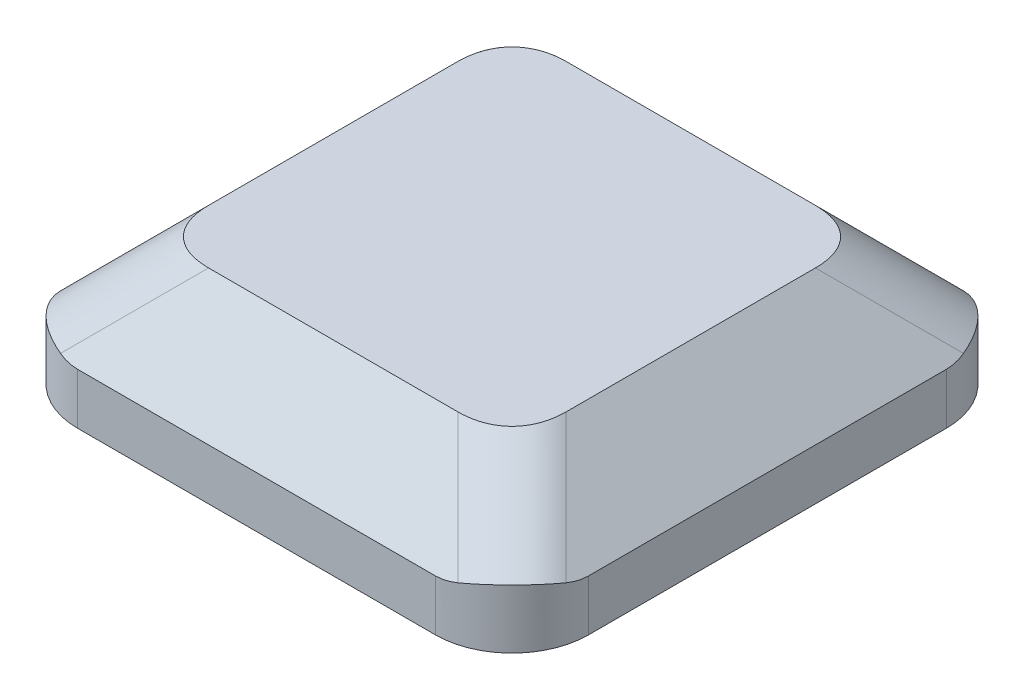
ISO-10303-21;
HEADER;
FILE_DESCRIPTION(('STEP AP214'),'2;1');
FILE_NAME('part.step','',(''),(''),'','','');
FILE_SCHEMA(('AUTOMOTIVE_DESIGN { 1 0 10303 214 1 1 1 1 }'));
ENDSEC;
DATA;
#1=APPLICATION_CONTEXT('core data for automotive mechanical design processes');
#2=APPLICATION_PROTOCOL_DEFINITION('international standard','automotive_design',2000,#1);
#3=PRODUCT_CONTEXT('',#1,'mechanical');
#4=PRODUCT('Part','Part','',(#3));
#5=PRODUCT_RELATED_PRODUCT_CATEGORY('part','',(#4));
#6=PRODUCT_DEFINITION_FORMATION('','',#4);
#7=PRODUCT_DEFINITION_CONTEXT('part definition',#1,'design');
#8=PRODUCT_DEFINITION('design','',#6,#7);
#9=PRODUCT_DEFINITION_SHAPE('','',#8);
#10=(LENGTH_UNIT() NAMED_UNIT(*) SI_UNIT(.MILLI.,.METRE.));
#11=(NAMED_UNIT(*) PLANE_ANGLE_UNIT() SI_UNIT($,.RADIAN.));
#12=(NAMED_UNIT(*) SI_UNIT($,.STERADIAN.) SOLID_ANGLE_UNIT());
#13=UNCERTAINTY_MEASURE_WITH_UNIT(LENGTH_MEASURE(1.E-05),#10,'distance_accuracy_value','');
#14=(GEOMETRIC_REPRESENTATION_CONTEXT(3) GLOBAL_UNCERTAINTY_ASSIGNED_CONTEXT((#13)) GLOBAL_UNIT_ASSIGNED_CONTEXT((#10,
#11,#12)) REPRESENTATION_CONTEXT('',''));
#15=CARTESIAN_POINT('',(0.,0.,0.));
#16=DIRECTION('',(0.,0.,1.));
#17=DIRECTION('',(1.,0.,0.));
#18=AXIS2_PLACEMENT_3D('',#15,#16,#17);
#19=CARTESIAN_POINT('',(0.,5.,0.));
#20=DIRECTION('',(0.,0.,-1.));
#21=DIRECTION('',(-1.,0.,0.));
#22=AXIS2_PLACEMENT_3D('',#19,#20,#21);
#23=PLANE('',#22);
#24=DIRECTION('',(-1.,0.,0.));
#25=VECTOR('',#24,1.);
#26=CARTESIAN_POINT('',(0.,1.99999999999999,0.));
#27=LINE('',#26,#25);
#28=CARTESIAN_POINT('',(17.,1.99999999999999,0.));
#29=VERTEX_POINT('',#28);
#30=CARTESIAN_POINT('',(3.,1.99999999999999,0.));
#31=VERTEX_POINT('',#30);
#32=EDGE_CURVE('E154',#29,#31,#27,.T.);
#33=ORIENTED_EDGE('',*,*,#32,.T.);
#34=DIRECTION('',(0.,-1.,0.));
#35=VECTOR('',#34,1.);
#36=CARTESIAN_POINT('',(3.,5.,0.));
#37=LINE('',#36,#35);
#38=CARTESIAN_POINT('',(3.,0.,0.));
#39=VERTEX_POINT('',#38);
#40=EDGE_CURVE('E161',#31,#39,#37,.T.);
#41=ORIENTED_EDGE('',*,*,#40,.T.);
#42=DIRECTION('',(1.,0.,0.));
#43=VECTOR('',#42,1.);
#44=CARTESIAN_POINT('',(0.,0.,0.));
#45=LINE('',#44,#43);
#46=CARTESIAN_POINT('',(17.,0.,0.));
#47=VERTEX_POINT('',#46);
#48=EDGE_CURVE('E157',#39,#47,#45,.T.);
#49=ORIENTED_EDGE('',*,*,#48,.T.);
#50=DIRECTION('',(0.,-1.,0.));
#51=VECTOR('',#50,1.);
#52=CARTESIAN_POINT('',(17.,1.99999999999999,0.));
#53=LINE('',#52,#51);
#54=EDGE_CURVE('E151',#47,#29,#53,.F.);
#55=ORIENTED_EDGE('',*,*,#54,.T.);
#56=EDGE_LOOP('',(#33,#41,#49,#55));
#57=FACE_BOUND('',#56,.T.);
#58=ADVANCED_FACE('F36',(#57),#23,.F.);
#59=CARTESIAN_POINT('',(20.,5.,-20.));
#60=DIRECTION('',(1.,0.,0.));
#61=DIRECTION('',(0.,0.,-1.));
#62=AXIS2_PLACEMENT_3D('',#59,#60,#61);
#63=PLANE('',#62);
#64=DIRECTION('',(0.,0.,1.));
#65=VECTOR('',#64,1.);
#66=CARTESIAN_POINT('',(20.,0.,-20.));
#67=LINE('',#66,#65);
#68=CARTESIAN_POINT('',(20.,0.,-17.));
#69=VERTEX_POINT('',#68);
#70=CARTESIAN_POINT('',(20.,0.,-3.));
#71=VERTEX_POINT('',#70);
#72=EDGE_CURVE('E293',#69,#71,#67,.T.);
#73=ORIENTED_EDGE('',*,*,#72,.F.);
#74=DIRECTION('',(0.,-1.,0.));
#75=VECTOR('',#74,1.);
#76=CARTESIAN_POINT('',(20.,5.,-17.));
#77=LINE('',#76,#75);
#78=CARTESIAN_POINT('',(20.,1.99999999999999,-17.));
#79=VERTEX_POINT('',#78);
#80=EDGE_CURVE('E209',#69,#79,#77,.F.);
#81=ORIENTED_EDGE('',*,*,#80,.T.);
#82=DIRECTION('',(0.,0.,1.));
#83=VECTOR('',#82,1.);
#84=CARTESIAN_POINT('',(20.,1.99999999999999,0.));
#85=LINE('',#84,#83);
#86=CARTESIAN_POINT('',(20.,1.99999999999999,-3.));
#87=VERTEX_POINT('',#86);
#88=EDGE_CURVE('E170',#79,#87,#85,.T.);
#89=ORIENTED_EDGE('',*,*,#88,.T.);
#90=DIRECTION('',(0.,-1.,0.));
#91=VECTOR('',#90,1.);
#92=CARTESIAN_POINT('',(20.,0.,-3.));
#93=LINE('',#92,#91);
#94=EDGE_CURVE('E207',#87,#71,#93,.T.);
#95=ORIENTED_EDGE('',*,*,#94,.T.);
#96=EDGE_LOOP('',(#73,#81,#89,#95));
#97=FACE_BOUND('',#96,.T.);
#98=ADVANCED_FACE('F325',(#97),#63,.T.);
#99=CARTESIAN_POINT('',(0.,5.,-20.));
#100=DIRECTION('',(0.,0.,-1.));
#101=DIRECTION('',(-1.,0.,0.));
#102=AXIS2_PLACEMENT_3D('',#99,#100,#101);
#103=PLANE('',#102);
#104=DIRECTION('',(1.,0.,0.));
#105=VECTOR('',#104,1.);
#106=CARTESIAN_POINT('',(0.,0.,-20.));
#107=LINE('',#106,#105);
#108=CARTESIAN_POINT('',(3.,0.,-20.));
#109=VERTEX_POINT('',#108);
#110=CARTESIAN_POINT('',(17.,0.,-20.));
#111=VERTEX_POINT('',#110);
#112=EDGE_CURVE('E242',#109,#111,#107,.T.);
#113=ORIENTED_EDGE('',*,*,#112,.F.);
#114=DIRECTION('',(0.,-1.,0.));
#115=VECTOR('',#114,1.);
#116=CARTESIAN_POINT('',(3.,1.99999999999999,-20.));
#117=LINE('',#116,#115);
#118=CARTESIAN_POINT('',(3.,1.99999999999999,-20.));
#119=VERTEX_POINT('',#118);
#120=EDGE_CURVE('E197',#109,#119,#117,.F.);
#121=ORIENTED_EDGE('',*,*,#120,.T.);
#122=DIRECTION('',(1.,0.,0.));
#123=VECTOR('',#122,1.);
#124=CARTESIAN_POINT('',(20.,1.99999999999999,-20.));
#125=LINE('',#124,#123);
#126=CARTESIAN_POINT('',(17.,1.99999999999999,-20.));
#127=VERTEX_POINT('',#126);
#128=EDGE_CURVE('E253',#119,#127,#125,.T.);
#129=ORIENTED_EDGE('',*,*,#128,.T.);
#130=DIRECTION('',(0.,-1.,0.));
#131=VECTOR('',#130,1.);
#132=CARTESIAN_POINT('',(17.,5.,-20.));
#133=LINE('',#132,#131);
#134=EDGE_CURVE('E194',#127,#111,#133,.T.);
#135=ORIENTED_EDGE('',*,*,#134,.T.);
#136=EDGE_LOOP('',(#113,#121,#129,#135));
#137=FACE_BOUND('',#136,.T.);
#138=ADVANCED_FACE('F301',(#137),#103,.T.);
#139=CARTESIAN_POINT('',(0.,5.,-20.));
#140=DIRECTION('',(1.,0.,0.));
#141=DIRECTION('',(0.,0.,-1.));
#142=AXIS2_PLACEMENT_3D('',#139,#140,#141);
#143=PLANE('',#142);
#144=DIRECTION('',(0.,0.,1.));
#145=VECTOR('',#144,1.);
#146=CARTESIAN_POINT('',(0.,0.,-20.));
#147=LINE('',#146,#145);
#148=CARTESIAN_POINT('',(0.,0.,-17.));
#149=VERTEX_POINT('',#148);
#150=CARTESIAN_POINT('',(0.,0.,-3.));
#151=VERTEX_POINT('',#150);
#152=EDGE_CURVE('E237',#149,#151,#147,.T.);
#153=ORIENTED_EDGE('',*,*,#152,.T.);
#154=DIRECTION('',(0.,-1.,0.));
#155=VECTOR('',#154,1.);
#156=CARTESIAN_POINT('',(0.,5.,-3.));
#157=LINE('',#156,#155);
#158=CARTESIAN_POINT('',(0.,1.99999999999999,-3.));
#159=VERTEX_POINT('',#158);
#160=EDGE_CURVE('E270',#151,#159,#157,.F.);
#161=ORIENTED_EDGE('',*,*,#160,.T.);
#162=DIRECTION('',(0.,0.,-1.));
#163=VECTOR('',#162,1.);
#164=CARTESIAN_POINT('',(0.,1.99999999999999,-20.));
#165=LINE('',#164,#163);
#166=CARTESIAN_POINT('',(0.,1.99999999999999,-17.));
#167=VERTEX_POINT('',#166);
#168=EDGE_CURVE('E250',#159,#167,#165,.T.);
#169=ORIENTED_EDGE('',*,*,#168,.T.);
#170=DIRECTION('',(0.,-1.,0.));
#171=VECTOR('',#170,1.);
#172=CARTESIAN_POINT('',(0.,0.,-17.));
#173=LINE('',#172,#171);
#174=EDGE_CURVE('E267',#167,#149,#173,.T.);
#175=ORIENTED_EDGE('',*,*,#174,.T.);
#176=EDGE_LOOP('',(#153,#161,#169,#175));
#177=FACE_BOUND('',#176,.T.);
#178=ADVANCED_FACE('F317',(#177),#143,.F.);
#179=CARTESIAN_POINT('',(0.,5.,0.));
#180=DIRECTION('',(0.,-1.,0.));
#181=DIRECTION('',(0.,0.,-1.));
#182=AXIS2_PLACEMENT_3D('',#179,#180,#181);
#183=PLANE('',#182);
#184=DIRECTION('',(0.,0.,1.));
#185=VECTOR('',#184,1.);
#186=CARTESIAN_POINT('',(3.,5.,0.));
#187=LINE('',#186,#185);
#188=CARTESIAN_POINT('',(3.,5.,-14.8786796564404));
#189=VERTEX_POINT('',#188);
#190=CARTESIAN_POINT('',(3.,5.,-5.12132034355965));
#191=VERTEX_POINT('',#190);
#192=EDGE_CURVE('E248',#189,#191,#187,.T.);
#193=ORIENTED_EDGE('',*,*,#192,.T.);
#194=CARTESIAN_POINT('',(7.24264068711928,5.,-7.24264068711928));
#195=DIRECTION('',(0.,-1.,0.));
#196=DIRECTION('',(0.707106781186548,0.,-0.707106781186548));
#197=AXIS2_PLACEMENT_3D('',#194,#195,#196);
#198=ELLIPSE('',#197,5.19615242270662,3.);
#199=CARTESIAN_POINT('',(5.12132034355965,5.,-3.));
#200=VERTEX_POINT('',#199);
#201=EDGE_CURVE('E192',#191,#200,#198,.F.);
#202=ORIENTED_EDGE('',*,*,#201,.T.);
#203=DIRECTION('',(1.,0.,0.));
#204=VECTOR('',#203,1.);
#205=CARTESIAN_POINT('',(0.,5.,-3.));
#206=LINE('',#205,#204);
#207=CARTESIAN_POINT('',(14.8786796564404,5.,-3.));
#208=VERTEX_POINT('',#207);
#209=EDGE_CURVE('E229',#200,#208,#206,.T.);
#210=ORIENTED_EDGE('',*,*,#209,.T.);
#211=CARTESIAN_POINT('',(12.7573593128807,5.,-7.24264068711928));
#212=DIRECTION('',(0.,-1.,0.));
#213=DIRECTION('',(0.707106781186548,0.,0.707106781186547));
#214=AXIS2_PLACEMENT_3D('',#211,#212,#213);
#215=ELLIPSE('',#214,5.19615242270662,3.);
#216=CARTESIAN_POINT('',(17.,5.,-5.12132034355965));
#217=VERTEX_POINT('',#216);
#218=EDGE_CURVE('E186',#208,#217,#215,.F.);
#219=ORIENTED_EDGE('',*,*,#218,.T.);
#220=DIRECTION('',(0.,0.,-1.));
#221=VECTOR('',#220,1.);
#222=CARTESIAN_POINT('',(17.,5.,-20.));
#223=LINE('',#222,#221);
#224=CARTESIAN_POINT('',(17.,5.,-14.8786796564404));
#225=VERTEX_POINT('',#224);
#226=EDGE_CURVE('E236',#217,#225,#223,.T.);
#227=ORIENTED_EDGE('',*,*,#226,.T.);
#228=CARTESIAN_POINT('',(12.7573593128807,5.,-12.7573593128807));
#229=DIRECTION('',(0.,-1.,0.));
#230=DIRECTION('',(0.707106781186547,0.,-0.707106781186548));
#231=AXIS2_PLACEMENT_3D('',#228,#229,#230);
#232=ELLIPSE('',#231,5.19615242270662,3.);
#233=CARTESIAN_POINT('',(14.8786796564404,5.,-17.));
#234=VERTEX_POINT('',#233);
#235=EDGE_CURVE('E188',#225,#234,#232,.F.);
#236=ORIENTED_EDGE('',*,*,#235,.T.);
#237=DIRECTION('',(-1.,0.,0.));
#238=VECTOR('',#237,1.);
#239=CARTESIAN_POINT('',(0.,5.,-17.));
#240=LINE('',#239,#238);
#241=CARTESIAN_POINT('',(5.12132034355964,5.,-17.));
#242=VERTEX_POINT('',#241);
#243=EDGE_CURVE('E239',#234,#242,#240,.T.);
#244=ORIENTED_EDGE('',*,*,#243,.T.);
#245=CARTESIAN_POINT('',(7.24264068711928,5.,-12.7573593128807));
#246=DIRECTION('',(0.,-1.,0.));
#247=DIRECTION('',(0.707106781186548,0.,0.707106781186548));
#248=AXIS2_PLACEMENT_3D('',#245,#246,#247);
#249=ELLIPSE('',#248,5.19615242270662,3.);
#250=EDGE_CURVE('E190',#242,#189,#249,.F.);
#251=ORIENTED_EDGE('',*,*,#250,.T.);
#252=EDGE_LOOP('',(#193,#202,#210,#219,#227,#236,#244,#251));
#253=FACE_BOUND('',#252,.T.);
#254=ADVANCED_FACE('F233',(#253),#183,.F.);
#255=CARTESIAN_POINT('',(0.,0.,0.));
#256=DIRECTION('',(0.,-1.,0.));
#257=DIRECTION('',(0.,0.,-1.));
#258=AXIS2_PLACEMENT_3D('',#255,#256,#257);
#259=PLANE('',#258);
#260=ORIENTED_EDGE('',*,*,#48,.F.);
#261=CARTESIAN_POINT('',(3.,0.,-3.));
#262=DIRECTION('',(0.,-1.,0.));
#263=DIRECTION('',(0.,0.,-1.));
#264=AXIS2_PLACEMENT_3D('',#261,#262,#263);
#265=CIRCLE('',#264,3.);
#266=EDGE_CURVE('E265',#39,#151,#265,.T.);
#267=ORIENTED_EDGE('',*,*,#266,.T.);
#268=ORIENTED_EDGE('',*,*,#152,.F.);
#269=CARTESIAN_POINT('',(3.,0.,-17.));
#270=DIRECTION('',(0.,-1.,0.));
#271=DIRECTION('',(0.,0.,-1.));
#272=AXIS2_PLACEMENT_3D('',#269,#270,#271);
#273=CIRCLE('',#272,3.);
#274=EDGE_CURVE('E263',#149,#109,#273,.T.);
#275=ORIENTED_EDGE('',*,*,#274,.T.);
#276=ORIENTED_EDGE('',*,*,#112,.T.);
#277=CARTESIAN_POINT('',(17.,0.,-17.));
#278=DIRECTION('',(0.,-1.,0.));
#279=DIRECTION('',(0.,0.,-1.));
#280=AXIS2_PLACEMENT_3D('',#277,#278,#279);
#281=CIRCLE('',#280,3.);
#282=EDGE_CURVE('E261',#111,#69,#281,.T.);
#283=ORIENTED_EDGE('',*,*,#282,.T.);
#284=ORIENTED_EDGE('',*,*,#72,.T.);
#285=CARTESIAN_POINT('',(17.,0.,-3.));
#286=DIRECTION('',(0.,-1.,0.));
#287=DIRECTION('',(0.,0.,-1.));
#288=AXIS2_PLACEMENT_3D('',#285,#286,#287);
#289=CIRCLE('',#288,3.);
#290=EDGE_CURVE('E259',#71,#47,#289,.T.);
#291=ORIENTED_EDGE('',*,*,#290,.T.);
#292=EDGE_LOOP('',(#260,#267,#268,#275,#276,#283,#284,#291));
#293=FACE_BOUND('',#292,.T.);
#294=ADVANCED_FACE('F290',(#293),#259,.T.);
#295=CARTESIAN_POINT('',(20.,1.99999999999999,-20.));
#296=DIRECTION('',(0.707106781186549,0.707106781186546,0.));
#297=DIRECTION('',(0.,0.,-1.));
#298=AXIS2_PLACEMENT_3D('',#295,#296,#297);
#299=PLANE('',#298);
#300=ORIENTED_EDGE('',*,*,#88,.F.);
#301=CARTESIAN_POINT('',(17.,5.,-17.));
#302=DIRECTION('',(0.707106781186549,0.707106781186546,0.));
#303=DIRECTION('',(0.707106781186546,-0.707106781186549,0.));
#304=AXIS2_PLACEMENT_3D('',#301,#302,#303);
#305=ELLIPSE('',#304,4.24264068711929,3.);
#306=CARTESIAN_POINT('',(19.8977774788672,2.10222252113279,-17.7764571353076));
#307=VERTEX_POINT('',#306);
#308=EDGE_CURVE('E11',#79,#307,#305,.T.);
#309=ORIENTED_EDGE('',*,*,#308,.T.);
#310=DIRECTION('',(0.577350269189625,-0.577350269189627,-0.577350269189625));
#311=VECTOR('',#310,1.);
#312=CARTESIAN_POINT('',(20.7071067811865,1.29289321881344,-18.5857864376269));
#313=LINE('',#312,#311);
#314=EDGE_CURVE('E45',#307,#225,#313,.F.);
#315=ORIENTED_EDGE('',*,*,#314,.T.);
#316=ORIENTED_EDGE('',*,*,#226,.F.);
#317=DIRECTION('',(0.577350269189625,-0.577350269189627,0.577350269189625));
#318=VECTOR('',#317,1.);
#319=CARTESIAN_POINT('',(14.0404401145199,7.95955988548011,-8.08088022903975));
#320=LINE('',#319,#318);
#321=CARTESIAN_POINT('',(19.8977774788672,2.10222252113278,-2.22354286469244));
#322=VERTEX_POINT('',#321);
#323=EDGE_CURVE('E58',#217,#322,#320,.T.);
#324=ORIENTED_EDGE('',*,*,#323,.T.);
#325=CARTESIAN_POINT('',(17.,5.,-3.));
#326=DIRECTION('',(0.707106781186549,0.707106781186546,0.));
#327=DIRECTION('',(-0.707106781186546,0.707106781186549,0.));
#328=AXIS2_PLACEMENT_3D('',#325,#326,#327);
#329=ELLIPSE('',#328,4.24264068711929,3.);
#330=EDGE_CURVE('E211',#322,#87,#329,.T.);
#331=ORIENTED_EDGE('',*,*,#330,.T.);
#332=EDGE_LOOP('',(#300,#309,#315,#316,#324,#331));
#333=FACE_BOUND('',#332,.T.);
#334=ADVANCED_FACE('F342',(#333),#299,.T.);
#335=CARTESIAN_POINT('',(0.,1.99999999999999,-20.));
#336=DIRECTION('',(0.,0.707106781186546,-0.707106781186549));
#337=DIRECTION('',(-1.,0.,0.));
#338=AXIS2_PLACEMENT_3D('',#335,#336,#337);
#339=PLANE('',#338);
#340=ORIENTED_EDGE('',*,*,#128,.F.);
#341=CARTESIAN_POINT('',(3.,5.,-17.));
#342=DIRECTION('',(0.,0.707106781186546,-0.707106781186549));
#343=DIRECTION('',(0.,0.707106781186549,0.707106781186546));
#344=AXIS2_PLACEMENT_3D('',#341,#342,#343);
#345=ELLIPSE('',#344,4.24264068711929,3.);
#346=CARTESIAN_POINT('',(2.22354286469244,2.10222252113278,-19.8977774788672));
#347=VERTEX_POINT('',#346);
#348=EDGE_CURVE('E205',#119,#347,#345,.T.);
#349=ORIENTED_EDGE('',*,*,#348,.T.);
#350=DIRECTION('',(0.577350269189625,0.577350269189627,0.577350269189625));
#351=VECTOR('',#350,1.);
#352=CARTESIAN_POINT('',(1.4142135623731,1.29289321881344,-20.7071067811865));
#353=LINE('',#352,#351);
#354=EDGE_CURVE('E203',#347,#242,#353,.T.);
#355=ORIENTED_EDGE('',*,*,#354,.T.);
#356=ORIENTED_EDGE('',*,*,#243,.F.);
#357=DIRECTION('',(0.577350269189625,-0.577350269189627,-0.577350269189625));
#358=VECTOR('',#357,1.);
#359=CARTESIAN_POINT('',(11.9191197709602,7.95955988548011,-14.0404401145199));
#360=LINE('',#359,#358);
#361=CARTESIAN_POINT('',(17.7764571353076,2.10222252113278,-19.8977774788672));
#362=VERTEX_POINT('',#361);
#363=EDGE_CURVE('E199',#234,#362,#360,.T.);
#364=ORIENTED_EDGE('',*,*,#363,.T.);
#365=CARTESIAN_POINT('',(17.,5.,-17.));
#366=DIRECTION('',(0.,0.707106781186546,-0.707106781186549));
#367=DIRECTION('',(0.,-0.707106781186549,-0.707106781186546));
#368=AXIS2_PLACEMENT_3D('',#365,#366,#367);
#369=ELLIPSE('',#368,4.24264068711929,3.);
#370=EDGE_CURVE('E201',#362,#127,#369,.T.);
#371=ORIENTED_EDGE('',*,*,#370,.T.);
#372=EDGE_LOOP('',(#340,#349,#355,#356,#364,#371));
#373=FACE_BOUND('',#372,.T.);
#374=ADVANCED_FACE('F312',(#373),#339,.T.);
#375=CARTESIAN_POINT('',(0.,5.,-3.));
#376=DIRECTION('',(0.,-0.707106781186546,-0.707106781186549));
#377=DIRECTION('',(1.,0.,0.));
#378=AXIS2_PLACEMENT_3D('',#375,#376,#377);
#379=PLANE('',#378);
#380=DIRECTION('',(-0.577350269189625,-0.577350269189627,0.577350269189625));
#381=VECTOR('',#380,1.);
#382=CARTESIAN_POINT('',(3.4142135623731,3.29289321881345,-1.29289321881345));
#383=LINE('',#382,#381);
#384=CARTESIAN_POINT('',(2.22354286469244,2.10222252113278,-0.102222521132794));
#385=VERTEX_POINT('',#384);
#386=EDGE_CURVE('E178',#200,#385,#383,.T.);
#387=ORIENTED_EDGE('',*,*,#386,.T.);
#388=CARTESIAN_POINT('',(3.,5.,-3.));
#389=DIRECTION('',(0.,-0.707106781186546,-0.707106781186549));
#390=DIRECTION('',(0.,-0.707106781186549,0.707106781186546));
#391=AXIS2_PLACEMENT_3D('',#388,#389,#390);
#392=ELLIPSE('',#391,4.24264068711929,3.);
#393=EDGE_CURVE('E169',#385,#31,#392,.F.);
#394=ORIENTED_EDGE('',*,*,#393,.T.);
#395=ORIENTED_EDGE('',*,*,#32,.F.);
#396=CARTESIAN_POINT('',(17.,5.,-3.));
#397=DIRECTION('',(0.,-0.707106781186546,-0.707106781186549));
#398=DIRECTION('',(0.,0.707106781186549,-0.707106781186546));
#399=AXIS2_PLACEMENT_3D('',#396,#397,#398);
#400=ELLIPSE('',#399,4.24264068711929,3.);
#401=CARTESIAN_POINT('',(17.7764571353076,2.10222252113278,-0.102222521132794));
#402=VERTEX_POINT('',#401);
#403=EDGE_CURVE('E166',#29,#402,#400,.F.);
#404=ORIENTED_EDGE('',*,*,#403,.T.);
#405=DIRECTION('',(-0.577350269189625,0.577350269189627,-0.577350269189625));
#406=VECTOR('',#405,1.);
#407=CARTESIAN_POINT('',(9.91911977096025,9.95955988548013,-7.95955988548011));
#408=LINE('',#407,#406);
#409=EDGE_CURVE('E175',#402,#208,#408,.T.);
#410=ORIENTED_EDGE('',*,*,#409,.T.);
#411=ORIENTED_EDGE('',*,*,#209,.F.);
#412=EDGE_LOOP('',(#387,#394,#395,#404,#410,#411));
#413=FACE_BOUND('',#412,.T.);
#414=ADVANCED_FACE('F164',(#413),#379,.F.);
#415=CARTESIAN_POINT('',(3.,5.,0.));
#416=DIRECTION('',(0.707106781186549,-0.707106781186546,0.));
#417=DIRECTION('',(0.,0.,1.));
#418=AXIS2_PLACEMENT_3D('',#415,#416,#417);
#419=PLANE('',#418);
#420=ORIENTED_EDGE('',*,*,#168,.F.);
#421=CARTESIAN_POINT('',(3.,5.,-3.));
#422=DIRECTION('',(0.707106781186549,-0.707106781186546,0.));
#423=DIRECTION('',(-0.707106781186546,-0.707106781186549,0.));
#424=AXIS2_PLACEMENT_3D('',#421,#422,#423);
#425=ELLIPSE('',#424,4.24264068711929,3.);
#426=CARTESIAN_POINT('',(0.102222521132795,2.10222252113279,-2.22354286469244));
#427=VERTEX_POINT('',#426);
#428=EDGE_CURVE('E176',#159,#427,#425,.F.);
#429=ORIENTED_EDGE('',*,*,#428,.T.);
#430=DIRECTION('',(-0.577350269189625,-0.577350269189627,0.577350269189625));
#431=VECTOR('',#430,1.);
#432=CARTESIAN_POINT('',(1.29289321881345,3.29289321881345,-3.4142135623731));
#433=LINE('',#432,#431);
#434=EDGE_CURVE('E180',#427,#191,#433,.F.);
#435=ORIENTED_EDGE('',*,*,#434,.T.);
#436=ORIENTED_EDGE('',*,*,#192,.F.);
#437=DIRECTION('',(-0.577350269189625,-0.577350269189627,-0.577350269189625));
#438=VECTOR('',#437,1.);
#439=CARTESIAN_POINT('',(7.9595598854801,9.95955988548012,-9.91911977096024));
#440=LINE('',#439,#438);
#441=CARTESIAN_POINT('',(0.102222521132792,2.10222252113278,-17.7764571353076));
#442=VERTEX_POINT('',#441);
#443=EDGE_CURVE('E272',#189,#442,#440,.T.);
#444=ORIENTED_EDGE('',*,*,#443,.T.);
#445=CARTESIAN_POINT('',(3.,5.,-17.));
#446=DIRECTION('',(0.707106781186549,-0.707106781186546,0.));
#447=DIRECTION('',(0.707106781186546,0.707106781186549,0.));
#448=AXIS2_PLACEMENT_3D('',#445,#446,#447);
#449=ELLIPSE('',#448,4.24264068711929,3.);
#450=EDGE_CURVE('E274',#442,#167,#449,.F.);
#451=ORIENTED_EDGE('',*,*,#450,.T.);
#452=EDGE_LOOP('',(#420,#429,#435,#436,#444,#451));
#453=FACE_BOUND('',#452,.T.);
#454=ADVANCED_FACE('F279',(#453),#419,.F.);
#455=CARTESIAN_POINT('',(3.4142135623731,1.17157287525381,-3.4142135623731));
#456=DIRECTION('',(0.577350269189625,0.577350269189627,-0.577350269189625));
#457=DIRECTION('',(0.,0.707106781186546,0.707106781186549));
#458=AXIS2_PLACEMENT_3D('',#455,#456,#457);
#459=CYLINDRICAL_SURFACE('',#458,3.);
#460=ORIENTED_EDGE('',*,*,#201,.F.);
#461=ORIENTED_EDGE('',*,*,#434,.F.);
#462=CARTESIAN_POINT('',(3.,0.757359312880709,-3.));
#463=DIRECTION('',(0.325057583671868,0.888073833977116,-0.325057583671868));
#464=DIRECTION('',(0.627963030199555,-0.459700843380982,-0.627963030199555));
#465=AXIS2_PLACEMENT_3D('',#462,#463,#464);
#466=ELLIPSE('',#465,3.37809750183148,3.);
#467=EDGE_CURVE('E215',#385,#427,#466,.F.);
#468=ORIENTED_EDGE('',*,*,#467,.F.);
#469=ORIENTED_EDGE('',*,*,#386,.F.);
#470=EDGE_LOOP('',(#460,#461,#468,#469));
#471=FACE_BOUND('',#470,.T.);
#472=ADVANCED_FACE('F285',(#471),#459,.T.);
#473=CARTESIAN_POINT('',(3.,5.,-3.));
#474=DIRECTION('',(0.,-1.,0.));
#475=DIRECTION('',(0.,0.,-1.));
#476=AXIS2_PLACEMENT_3D('',#473,#474,#475);
#477=CYLINDRICAL_SURFACE('',#476,3.);
#478=ORIENTED_EDGE('',*,*,#428,.F.);
#479=ORIENTED_EDGE('',*,*,#160,.F.);
#480=ORIENTED_EDGE('',*,*,#266,.F.);
#481=ORIENTED_EDGE('',*,*,#40,.F.);
#482=ORIENTED_EDGE('',*,*,#393,.F.);
#483=ORIENTED_EDGE('',*,*,#467,.T.);
#484=EDGE_LOOP('',(#478,#479,#480,#481,#482,#483));
#485=FACE_BOUND('',#484,.T.);
#486=ADVANCED_FACE('F287',(#485),#477,.T.);
#487=CARTESIAN_POINT('',(10.0808802290398,7.83823954192048,-9.91911977096025));
#488=DIRECTION('',(0.577350269189625,0.577350269189627,0.577350269189625));
#489=DIRECTION('',(0.,-0.707106781186546,0.707106781186549));
#490=AXIS2_PLACEMENT_3D('',#487,#488,#489);
#491=CYLINDRICAL_SURFACE('',#490,3.);
#492=ORIENTED_EDGE('',*,*,#250,.F.);
#493=ORIENTED_EDGE('',*,*,#354,.F.);
#494=CARTESIAN_POINT('',(3.,0.75735931288071,-17.));
#495=DIRECTION('',(0.325057583671868,0.888073833977116,0.325057583671868));
#496=DIRECTION('',(0.627963030199555,-0.459700843380982,0.627963030199555));
#497=AXIS2_PLACEMENT_3D('',#494,#495,#496);
#498=ELLIPSE('',#497,3.37809750183148,3.);
#499=EDGE_CURVE('E218',#442,#347,#498,.F.);
#500=ORIENTED_EDGE('',*,*,#499,.F.);
#501=ORIENTED_EDGE('',*,*,#443,.F.);
#502=EDGE_LOOP('',(#492,#493,#500,#501));
#503=FACE_BOUND('',#502,.T.);
#504=ADVANCED_FACE('F315',(#503),#491,.T.);
#505=CARTESIAN_POINT('',(3.,5.,-17.));
#506=DIRECTION('',(0.,1.,0.));
#507=DIRECTION('',(0.,0.,1.));
#508=AXIS2_PLACEMENT_3D('',#505,#506,#507);
#509=CYLINDRICAL_SURFACE('',#508,3.);
#510=ORIENTED_EDGE('',*,*,#348,.F.);
#511=ORIENTED_EDGE('',*,*,#120,.F.);
#512=ORIENTED_EDGE('',*,*,#274,.F.);
#513=ORIENTED_EDGE('',*,*,#174,.F.);
#514=ORIENTED_EDGE('',*,*,#450,.F.);
#515=ORIENTED_EDGE('',*,*,#499,.T.);
#516=EDGE_LOOP('',(#510,#511,#512,#513,#514,#515));
#517=FACE_BOUND('',#516,.T.);
#518=ADVANCED_FACE('F306',(#517),#509,.T.);
#519=CARTESIAN_POINT('',(11.9191197709602,5.83823954192047,-11.9191197709602));
#520=DIRECTION('',(0.577350269189625,-0.577350269189627,-0.577350269189625));
#521=DIRECTION('',(0.,0.707106781186546,-0.707106781186549));
#522=AXIS2_PLACEMENT_3D('',#519,#520,#521);
#523=CYLINDRICAL_SURFACE('',#522,3.);
#524=ORIENTED_EDGE('',*,*,#235,.F.);
#525=ORIENTED_EDGE('',*,*,#314,.F.);
#526=CARTESIAN_POINT('',(17.,0.757359312880707,-17.));
#527=DIRECTION('',(0.325057583671868,-0.888073833977116,-0.325057583671868));
#528=DIRECTION('',(0.627963030199555,0.459700843380982,-0.627963030199555));
#529=AXIS2_PLACEMENT_3D('',#526,#527,#528);
#530=ELLIPSE('',#529,3.37809750183148,3.);
#531=EDGE_CURVE('E220',#362,#307,#530,.T.);
#532=ORIENTED_EDGE('',*,*,#531,.F.);
#533=ORIENTED_EDGE('',*,*,#363,.F.);
#534=EDGE_LOOP('',(#524,#525,#532,#533));
#535=FACE_BOUND('',#534,.T.);
#536=ADVANCED_FACE('F351',(#535),#523,.T.);
#537=CARTESIAN_POINT('',(17.,5.,-17.));
#538=DIRECTION('',(0.,-1.,0.));
#539=DIRECTION('',(0.,0.,-1.));
#540=AXIS2_PLACEMENT_3D('',#537,#538,#539);
#541=CYLINDRICAL_SURFACE('',#540,3.);
#542=ORIENTED_EDGE('',*,*,#308,.F.);
#543=ORIENTED_EDGE('',*,*,#80,.F.);
#544=ORIENTED_EDGE('',*,*,#282,.F.);
#545=ORIENTED_EDGE('',*,*,#134,.F.);
#546=ORIENTED_EDGE('',*,*,#370,.F.);
#547=ORIENTED_EDGE('',*,*,#531,.T.);
#548=EDGE_LOOP('',(#542,#543,#544,#545,#546,#547));
#549=FACE_BOUND('',#548,.T.);
#550=ADVANCED_FACE('F354',(#549),#541,.T.);
#551=CARTESIAN_POINT('',(17.,5.,-3.));
#552=DIRECTION('',(0.,1.,0.));
#553=DIRECTION('',(0.,0.,1.));
#554=AXIS2_PLACEMENT_3D('',#551,#552,#553);
#555=CYLINDRICAL_SURFACE('',#554,3.);
#556=ORIENTED_EDGE('',*,*,#94,.F.);
#557=ORIENTED_EDGE('',*,*,#330,.F.);
#558=CARTESIAN_POINT('',(17.,0.757359312880708,-3.));
#559=DIRECTION('',(-0.325057583671868,0.888073833977116,-0.325057583671868));
#560=DIRECTION('',(0.627963030199555,0.459700843380982,0.627963030199554));
#561=AXIS2_PLACEMENT_3D('',#558,#559,#560);
#562=ELLIPSE('',#561,3.37809750183148,3.);
#563=EDGE_CURVE('E40',#402,#322,#562,.T.);
#564=ORIENTED_EDGE('',*,*,#563,.F.);
#565=ORIENTED_EDGE('',*,*,#403,.F.);
#566=ORIENTED_EDGE('',*,*,#54,.F.);
#567=ORIENTED_EDGE('',*,*,#290,.F.);
#568=EDGE_LOOP('',(#556,#557,#564,#565,#566,#567));
#569=FACE_BOUND('',#568,.T.);
#570=ADVANCED_FACE('F38',(#569),#555,.T.);
#571=CARTESIAN_POINT('',(9.91911977096025,7.83823954192049,-10.0808802290398));
#572=DIRECTION('',(0.577350269189625,-0.577350269189627,0.577350269189625));
#573=DIRECTION('',(0.707106781186549,0.707106781186546,0.));
#574=AXIS2_PLACEMENT_3D('',#571,#572,#573);
#575=CYLINDRICAL_SURFACE('',#574,3.);
#576=ORIENTED_EDGE('',*,*,#563,.T.);
#577=ORIENTED_EDGE('',*,*,#323,.F.);
#578=ORIENTED_EDGE('',*,*,#218,.F.);
#579=ORIENTED_EDGE('',*,*,#409,.F.);
#580=EDGE_LOOP('',(#576,#577,#578,#579));
#581=FACE_BOUND('',#580,.T.);
#582=ADVANCED_FACE('F226',(#581),#575,.T.);
#583=CLOSED_SHELL('',(#58,#98,#138,#178,#254,#294,#334,#374,#414,#454,#472,#486,#504,#518,#536,
#550,#570,#582));
#584=MANIFOLD_SOLID_BREP('B2',#583);
#585=ADVANCED_BREP_SHAPE_REPRESENTATION('',(#18,#584),#14);
#586=SHAPE_DEFINITION_REPRESENTATION(#9,#585);
ENDSEC;
END-ISO-10303-21;
